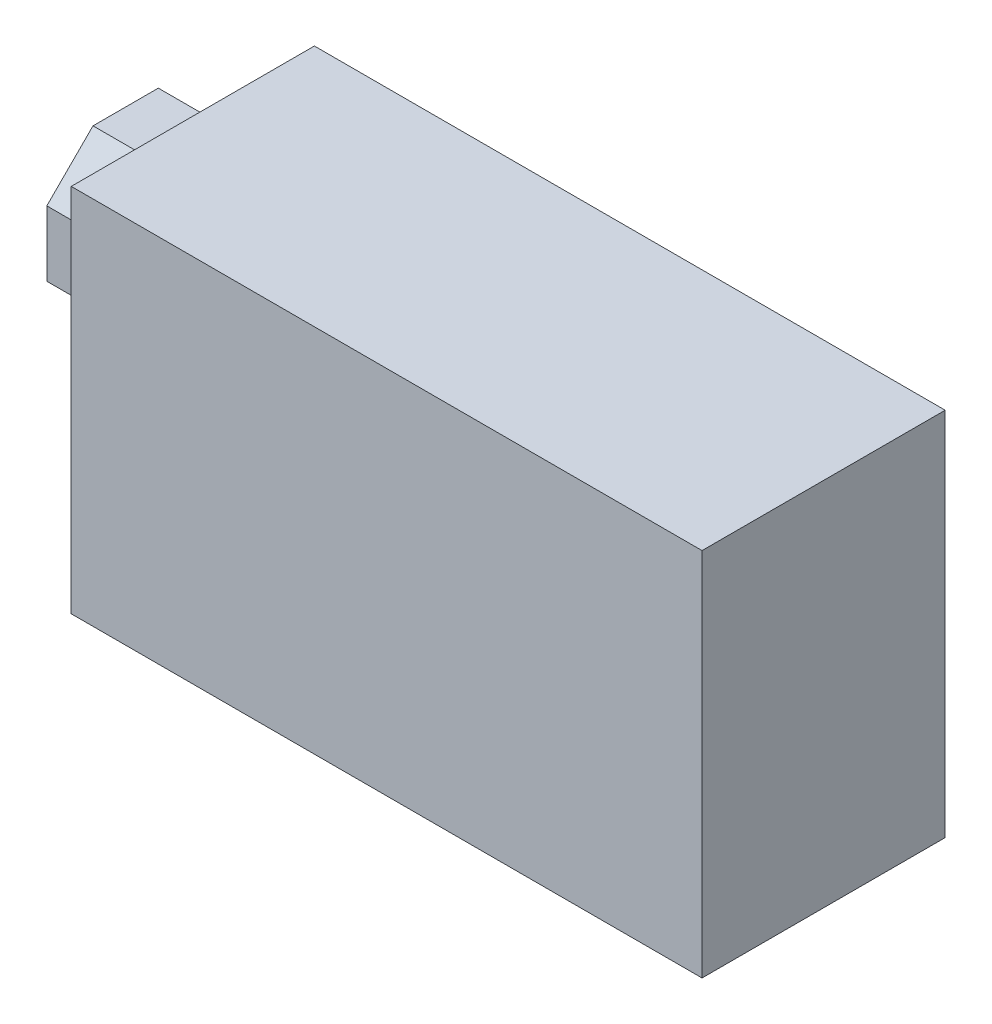
ISO-10303-21;
HEADER;
FILE_DESCRIPTION(('STEP AP214'),'2;1');
FILE_NAME('part.step','',(''),(''),'','','');
FILE_SCHEMA(('AUTOMOTIVE_DESIGN { 1 0 10303 214 1 1 1 1 }'));
ENDSEC;
DATA;
#1=APPLICATION_CONTEXT('core data for automotive mechanical design processes');
#2=APPLICATION_PROTOCOL_DEFINITION('international standard','automotive_design',2000,#1);
#3=PRODUCT_CONTEXT('',#1,'mechanical');
#4=PRODUCT('Part','Part','',(#3));
#5=PRODUCT_RELATED_PRODUCT_CATEGORY('part','',(#4));
#6=PRODUCT_DEFINITION_FORMATION('','',#4);
#7=PRODUCT_DEFINITION_CONTEXT('part definition',#1,'design');
#8=PRODUCT_DEFINITION('design','',#6,#7);
#9=PRODUCT_DEFINITION_SHAPE('','',#8);
#10=(LENGTH_UNIT() NAMED_UNIT(*) SI_UNIT(.MILLI.,.METRE.));
#11=(NAMED_UNIT(*) PLANE_ANGLE_UNIT() SI_UNIT($,.RADIAN.));
#12=(NAMED_UNIT(*) SI_UNIT($,.STERADIAN.) SOLID_ANGLE_UNIT());
#13=UNCERTAINTY_MEASURE_WITH_UNIT(LENGTH_MEASURE(1.E-05),#10,'distance_accuracy_value','');
#14=(GEOMETRIC_REPRESENTATION_CONTEXT(3) GLOBAL_UNCERTAINTY_ASSIGNED_CONTEXT((#13)) GLOBAL_UNIT_ASSIGNED_CONTEXT((#10,
#11,#12)) REPRESENTATION_CONTEXT('',''));
#15=CARTESIAN_POINT('',(0.,0.,0.));
#16=DIRECTION('',(0.,0.,1.));
#17=DIRECTION('',(1.,0.,0.));
#18=AXIS2_PLACEMENT_3D('',#15,#16,#17);
#19=CARTESIAN_POINT('',(0.,0.,17.018));
#20=DIRECTION('',(1.,0.,0.));
#21=DIRECTION('',(0.,0.,-1.));
#22=AXIS2_PLACEMENT_3D('',#19,#20,#21);
#23=PLANE('',#22);
#24=DIRECTION('',(0.,-1.,0.));
#25=VECTOR('',#24,1.);
#26=CARTESIAN_POINT('',(0.,0.,0.));
#27=LINE('',#26,#25);
#28=CARTESIAN_POINT('',(0.,25.908,0.));
#29=VERTEX_POINT('',#28);
#30=CARTESIAN_POINT('',(0.,0.,0.));
#31=VERTEX_POINT('',#30);
#32=EDGE_CURVE('E312',#29,#31,#27,.T.);
#33=ORIENTED_EDGE('',*,*,#32,.T.);
#34=DIRECTION('',(0.,0.,-1.));
#35=VECTOR('',#34,1.);
#36=CARTESIAN_POINT('',(0.,0.,17.018));
#37=LINE('',#36,#35);
#38=CARTESIAN_POINT('',(0.,0.,17.018));
#39=VERTEX_POINT('',#38);
#40=EDGE_CURVE('E44',#39,#31,#37,.T.);
#41=ORIENTED_EDGE('',*,*,#40,.F.);
#42=DIRECTION('',(0.,-1.,0.));
#43=VECTOR('',#42,1.);
#44=CARTESIAN_POINT('',(0.,0.,17.018));
#45=LINE('',#44,#43);
#46=CARTESIAN_POINT('',(0.,25.908,17.018));
#47=VERTEX_POINT('',#46);
#48=EDGE_CURVE('E313',#47,#39,#45,.T.);
#49=ORIENTED_EDGE('',*,*,#48,.F.);
#50=DIRECTION('',(0.,0.,-1.));
#51=VECTOR('',#50,1.);
#52=CARTESIAN_POINT('',(0.,25.908,17.018));
#53=LINE('',#52,#51);
#54=EDGE_CURVE('E323',#47,#29,#53,.T.);
#55=ORIENTED_EDGE('',*,*,#54,.T.);
#56=EDGE_LOOP('',(#33,#41,#49,#55));
#57=FACE_BOUND('',#56,.T.);
#58=CARTESIAN_POINT('',(0.,6.60269083227733,8.509));
#59=DIRECTION('',(1.,0.,0.));
#60=DIRECTION('',(0.,0.,-1.));
#61=AXIS2_PLACEMENT_3D('',#58,#59,#60);
#62=CIRCLE('',#61,3.556);
#63=CARTESIAN_POINT('',(0.,6.60269083227733,4.953));
#64=VERTEX_POINT('',#63);
#65=EDGE_CURVE('E11',#64,#64,#62,.F.);
#66=ORIENTED_EDGE('',*,*,#65,.F.);
#67=EDGE_LOOP('',(#66));
#68=FACE_BOUND('',#67,.T.);
#69=DIRECTION('',(0.,1.,0.));
#70=VECTOR('',#69,1.);
#71=CARTESIAN_POINT('',(0.,16.311427677462,14.0278922035849));
#72=LINE('',#71,#70);
#73=CARTESIAN_POINT('',(0.,16.311427677462,14.0278922035849));
#74=VERTEX_POINT('',#73);
#75=CARTESIAN_POINT('',(0.,20.883427677462,14.0278922035849));
#76=VERTEX_POINT('',#75);
#77=EDGE_CURVE('E265',#74,#76,#72,.T.);
#78=ORIENTED_EDGE('',*,*,#77,.F.);
#79=DIRECTION('',(0.,0.707106781186548,0.707106781186547));
#80=VECTOR('',#79,1.);
#81=CARTESIAN_POINT('',(0.,13.0785354738771,10.795));
#82=LINE('',#81,#80);
#83=CARTESIAN_POINT('',(0.,13.0785354738771,10.795));
#84=VERTEX_POINT('',#83);
#85=EDGE_CURVE('E250',#84,#74,#82,.T.);
#86=ORIENTED_EDGE('',*,*,#85,.F.);
#87=DIRECTION('',(0.,0.,1.));
#88=VECTOR('',#87,1.);
#89=CARTESIAN_POINT('',(0.,13.0785354738771,6.223));
#90=LINE('',#89,#88);
#91=CARTESIAN_POINT('',(0.,13.0785354738771,6.223));
#92=VERTEX_POINT('',#91);
#93=EDGE_CURVE('E282',#92,#84,#90,.T.);
#94=ORIENTED_EDGE('',*,*,#93,.F.);
#95=DIRECTION('',(0.,-0.707106781186547,0.707106781186547));
#96=VECTOR('',#95,1.);
#97=CARTESIAN_POINT('',(0.,16.311427677462,2.99010779641511));
#98=LINE('',#97,#96);
#99=CARTESIAN_POINT('',(0.,16.311427677462,2.99010779641511));
#100=VERTEX_POINT('',#99);
#101=EDGE_CURVE('E279',#100,#92,#98,.T.);
#102=ORIENTED_EDGE('',*,*,#101,.F.);
#103=DIRECTION('',(0.,-1.,0.));
#104=VECTOR('',#103,1.);
#105=CARTESIAN_POINT('',(0.,20.883427677462,2.99010779641511));
#106=LINE('',#105,#104);
#107=CARTESIAN_POINT('',(0.,20.883427677462,2.99010779641511));
#108=VERTEX_POINT('',#107);
#109=EDGE_CURVE('E276',#108,#100,#106,.T.);
#110=ORIENTED_EDGE('',*,*,#109,.F.);
#111=DIRECTION('',(0.,-0.707106781186548,-0.707106781186547));
#112=VECTOR('',#111,1.);
#113=CARTESIAN_POINT('',(0.,24.1163198810469,6.223));
#114=LINE('',#113,#112);
#115=CARTESIAN_POINT('',(0.,24.1163198810469,6.223));
#116=VERTEX_POINT('',#115);
#117=EDGE_CURVE('E273',#116,#108,#114,.T.);
#118=ORIENTED_EDGE('',*,*,#117,.F.);
#119=DIRECTION('',(0.,0.,-1.));
#120=VECTOR('',#119,1.);
#121=CARTESIAN_POINT('',(0.,24.1163198810469,10.795));
#122=LINE('',#121,#120);
#123=CARTESIAN_POINT('',(0.,24.1163198810469,10.795));
#124=VERTEX_POINT('',#123);
#125=EDGE_CURVE('E270',#124,#116,#122,.T.);
#126=ORIENTED_EDGE('',*,*,#125,.F.);
#127=DIRECTION('',(0.,0.707106781186548,-0.707106781186548));
#128=VECTOR('',#127,1.);
#129=CARTESIAN_POINT('',(0.,20.883427677462,14.0278922035849));
#130=LINE('',#129,#128);
#131=EDGE_CURVE('E59',#76,#124,#130,.T.);
#132=ORIENTED_EDGE('',*,*,#131,.F.);
#133=EDGE_LOOP('',(#78,#86,#94,#102,#110,#118,#126,#132));
#134=FACE_BOUND('',#133,.T.);
#135=ADVANCED_FACE('F37',(#57,#68,#134),#23,.F.);
#136=CARTESIAN_POINT('',(0.,0.,17.018));
#137=DIRECTION('',(0.,1.,0.));
#138=DIRECTION('',(0.,0.,1.));
#139=AXIS2_PLACEMENT_3D('',#136,#137,#138);
#140=PLANE('',#139);
#141=DIRECTION('',(1.,0.,0.));
#142=VECTOR('',#141,1.);
#143=CARTESIAN_POINT('',(0.,0.,0.));
#144=LINE('',#143,#142);
#145=CARTESIAN_POINT('',(44.15,0.,0.));
#146=VERTEX_POINT('',#145);
#147=EDGE_CURVE('E326',#31,#146,#144,.T.);
#148=ORIENTED_EDGE('',*,*,#147,.T.);
#149=DIRECTION('',(0.,0.,-1.));
#150=VECTOR('',#149,1.);
#151=CARTESIAN_POINT('',(44.15,0.,17.018));
#152=LINE('',#151,#150);
#153=CARTESIAN_POINT('',(44.15,0.,17.018));
#154=VERTEX_POINT('',#153);
#155=EDGE_CURVE('E336',#154,#146,#152,.T.);
#156=ORIENTED_EDGE('',*,*,#155,.F.);
#157=DIRECTION('',(1.,0.,0.));
#158=VECTOR('',#157,1.);
#159=CARTESIAN_POINT('',(0.,0.,17.018));
#160=LINE('',#159,#158);
#161=EDGE_CURVE('E316',#39,#154,#160,.T.);
#162=ORIENTED_EDGE('',*,*,#161,.F.);
#163=ORIENTED_EDGE('',*,*,#40,.T.);
#164=EDGE_LOOP('',(#148,#156,#162,#163));
#165=FACE_BOUND('',#164,.T.);
#166=ADVANCED_FACE('F341',(#165),#140,.F.);
#167=CARTESIAN_POINT('',(44.15,0.,17.018));
#168=DIRECTION('',(-1.,0.,0.));
#169=DIRECTION('',(0.,0.,1.));
#170=AXIS2_PLACEMENT_3D('',#167,#168,#169);
#171=PLANE('',#170);
#172=DIRECTION('',(0.,1.,0.));
#173=VECTOR('',#172,1.);
#174=CARTESIAN_POINT('',(44.15,0.,0.));
#175=LINE('',#174,#173);
#176=CARTESIAN_POINT('',(44.15,25.908,0.));
#177=VERTEX_POINT('',#176);
#178=EDGE_CURVE('E328',#146,#177,#175,.T.);
#179=ORIENTED_EDGE('',*,*,#178,.T.);
#180=DIRECTION('',(0.,0.,-1.));
#181=VECTOR('',#180,1.);
#182=CARTESIAN_POINT('',(44.15,25.908,17.018));
#183=LINE('',#182,#181);
#184=CARTESIAN_POINT('',(44.15,25.908,17.018));
#185=VERTEX_POINT('',#184);
#186=EDGE_CURVE('E333',#185,#177,#183,.T.);
#187=ORIENTED_EDGE('',*,*,#186,.F.);
#188=DIRECTION('',(0.,1.,0.));
#189=VECTOR('',#188,1.);
#190=CARTESIAN_POINT('',(44.15,0.,17.018));
#191=LINE('',#190,#189);
#192=EDGE_CURVE('E319',#154,#185,#191,.T.);
#193=ORIENTED_EDGE('',*,*,#192,.F.);
#194=ORIENTED_EDGE('',*,*,#155,.T.);
#195=EDGE_LOOP('',(#179,#187,#193,#194));
#196=FACE_BOUND('',#195,.T.);
#197=ADVANCED_FACE('F354',(#196),#171,.F.);
#198=CARTESIAN_POINT('',(0.,25.908,17.018));
#199=DIRECTION('',(0.,-1.,0.));
#200=DIRECTION('',(1.,0.,0.));
#201=AXIS2_PLACEMENT_3D('',#198,#199,#200);
#202=PLANE('',#201);
#203=DIRECTION('',(-1.,0.,0.));
#204=VECTOR('',#203,1.);
#205=CARTESIAN_POINT('',(0.,25.908,0.));
#206=LINE('',#205,#204);
#207=EDGE_CURVE('E317',#177,#29,#206,.T.);
#208=ORIENTED_EDGE('',*,*,#207,.T.);
#209=ORIENTED_EDGE('',*,*,#54,.F.);
#210=DIRECTION('',(-1.,0.,0.));
#211=VECTOR('',#210,1.);
#212=CARTESIAN_POINT('',(0.,25.908,17.018));
#213=LINE('',#212,#211);
#214=EDGE_CURVE('E321',#185,#47,#213,.T.);
#215=ORIENTED_EDGE('',*,*,#214,.F.);
#216=ORIENTED_EDGE('',*,*,#186,.T.);
#217=EDGE_LOOP('',(#208,#209,#215,#216));
#218=FACE_BOUND('',#217,.T.);
#219=ADVANCED_FACE('F358',(#218),#202,.F.);
#220=CARTESIAN_POINT('',(0.,0.,17.018));
#221=DIRECTION('',(0.,0.,-1.));
#222=DIRECTION('',(-1.,0.,0.));
#223=AXIS2_PLACEMENT_3D('',#220,#221,#222);
#224=PLANE('',#223);
#225=ORIENTED_EDGE('',*,*,#48,.T.);
#226=ORIENTED_EDGE('',*,*,#161,.T.);
#227=ORIENTED_EDGE('',*,*,#192,.T.);
#228=ORIENTED_EDGE('',*,*,#214,.T.);
#229=EDGE_LOOP('',(#225,#226,#227,#228));
#230=FACE_BOUND('',#229,.T.);
#231=ADVANCED_FACE('F360',(#230),#224,.F.);
#232=CARTESIAN_POINT('',(0.,0.,0.));
#233=DIRECTION('',(0.,0.,-1.));
#234=DIRECTION('',(-1.,0.,0.));
#235=AXIS2_PLACEMENT_3D('',#232,#233,#234);
#236=PLANE('',#235);
#237=ORIENTED_EDGE('',*,*,#32,.F.);
#238=ORIENTED_EDGE('',*,*,#207,.F.);
#239=ORIENTED_EDGE('',*,*,#178,.F.);
#240=ORIENTED_EDGE('',*,*,#147,.F.);
#241=EDGE_LOOP('',(#237,#238,#239,#240));
#242=FACE_BOUND('',#241,.T.);
#243=ADVANCED_FACE('F350',(#242),#236,.T.);
#244=CARTESIAN_POINT('',(-4.7,6.60269083227733,8.509));
#245=DIRECTION('',(1.,0.,0.));
#246=DIRECTION('',(0.,0.,-1.));
#247=AXIS2_PLACEMENT_3D('',#244,#245,#246);
#248=CYLINDRICAL_SURFACE('',#247,3.556);
#249=CARTESIAN_POINT('',(-4.7,6.60269083227733,8.509));
#250=DIRECTION('',(-1.,0.,0.));
#251=DIRECTION('',(0.,0.,1.));
#252=AXIS2_PLACEMENT_3D('',#249,#250,#251);
#253=CIRCLE('',#252,3.556);
#254=CARTESIAN_POINT('',(-4.7,6.60269083227733,12.065));
#255=VERTEX_POINT('',#254);
#256=EDGE_CURVE('E309',#255,#255,#253,.T.);
#257=ORIENTED_EDGE('',*,*,#256,.F.);
#258=EDGE_LOOP('',(#257));
#259=FACE_BOUND('',#258,.T.);
#260=ORIENTED_EDGE('',*,*,#65,.T.);
#261=EDGE_LOOP('',(#260));
#262=FACE_BOUND('',#261,.T.);
#263=ADVANCED_FACE('F367',(#259,#262),#248,.T.);
#264=CARTESIAN_POINT('',(-4.7,6.60269083227733,8.509));
#265=DIRECTION('',(-1.,0.,0.));
#266=DIRECTION('',(0.,0.,1.));
#267=AXIS2_PLACEMENT_3D('',#264,#265,#266);
#268=PLANE('',#267);
#269=CARTESIAN_POINT('',(-4.7,6.60269083227733,8.509));
#270=DIRECTION('',(-1.,0.,0.));
#271=DIRECTION('',(0.,0.,1.));
#272=AXIS2_PLACEMENT_3D('',#269,#270,#271);
#273=CIRCLE('',#272,2.43860682896145);
#274=CARTESIAN_POINT('',(-4.7,6.60269083227733,10.9476068289615));
#275=VERTEX_POINT('',#274);
#276=EDGE_CURVE('E200',#275,#275,#273,.T.);
#277=ORIENTED_EDGE('',*,*,#276,.F.);
#278=EDGE_LOOP('',(#277));
#279=FACE_BOUND('',#278,.T.);
#280=ORIENTED_EDGE('',*,*,#256,.T.);
#281=EDGE_LOOP('',(#280));
#282=FACE_BOUND('',#281,.T.);
#283=ADVANCED_FACE('F400',(#279,#282),#268,.T.);
#284=CARTESIAN_POINT('',(-4.7,16.311427677462,14.0278922035849));
#285=DIRECTION('',(0.,0.,-1.));
#286=DIRECTION('',(0.,1.,0.));
#287=AXIS2_PLACEMENT_3D('',#284,#285,#286);
#288=PLANE('',#287);
#289=ORIENTED_EDGE('',*,*,#77,.T.);
#290=DIRECTION('',(1.,0.,0.));
#291=VECTOR('',#290,1.);
#292=CARTESIAN_POINT('',(-4.7,20.883427677462,14.0278922035849));
#293=LINE('',#292,#291);
#294=CARTESIAN_POINT('',(-4.7,20.883427677462,14.0278922035849));
#295=VERTEX_POINT('',#294);
#296=EDGE_CURVE('E307',#295,#76,#293,.T.);
#297=ORIENTED_EDGE('',*,*,#296,.F.);
#298=DIRECTION('',(0.,1.,0.));
#299=VECTOR('',#298,1.);
#300=CARTESIAN_POINT('',(-4.7,16.311427677462,14.0278922035849));
#301=LINE('',#300,#299);
#302=CARTESIAN_POINT('',(-4.7,16.311427677462,14.0278922035849));
#303=VERTEX_POINT('',#302);
#304=EDGE_CURVE('E246',#303,#295,#301,.T.);
#305=ORIENTED_EDGE('',*,*,#304,.F.);
#306=DIRECTION('',(1.,0.,0.));
#307=VECTOR('',#306,1.);
#308=CARTESIAN_POINT('',(-4.7,16.311427677462,14.0278922035849));
#309=LINE('',#308,#307);
#310=EDGE_CURVE('E264',#303,#74,#309,.T.);
#311=ORIENTED_EDGE('',*,*,#310,.T.);
#312=EDGE_LOOP('',(#289,#297,#305,#311));
#313=FACE_BOUND('',#312,.T.);
#314=ADVANCED_FACE('F423',(#313),#288,.F.);
#315=CARTESIAN_POINT('',(-4.7,20.883427677462,14.0278922035849));
#316=DIRECTION('',(0.,-0.707106781186548,-0.707106781186548));
#317=DIRECTION('',(0.,0.707106781186548,-0.707106781186548));
#318=AXIS2_PLACEMENT_3D('',#315,#316,#317);
#319=PLANE('',#318);
#320=ORIENTED_EDGE('',*,*,#131,.T.);
#321=DIRECTION('',(1.,0.,0.));
#322=VECTOR('',#321,1.);
#323=CARTESIAN_POINT('',(-4.7,24.1163198810469,10.795));
#324=LINE('',#323,#322);
#325=CARTESIAN_POINT('',(-4.7,24.1163198810469,10.795));
#326=VERTEX_POINT('',#325);
#327=EDGE_CURVE('E304',#326,#124,#324,.T.);
#328=ORIENTED_EDGE('',*,*,#327,.F.);
#329=DIRECTION('',(0.,0.707106781186548,-0.707106781186548));
#330=VECTOR('',#329,1.);
#331=CARTESIAN_POINT('',(-4.7,20.883427677462,14.0278922035849));
#332=LINE('',#331,#330);
#333=EDGE_CURVE('E249',#295,#326,#332,.T.);
#334=ORIENTED_EDGE('',*,*,#333,.F.);
#335=ORIENTED_EDGE('',*,*,#296,.T.);
#336=EDGE_LOOP('',(#320,#328,#334,#335));
#337=FACE_BOUND('',#336,.T.);
#338=ADVANCED_FACE('F427',(#337),#319,.F.);
#339=CARTESIAN_POINT('',(-4.7,24.1163198810469,10.795));
#340=DIRECTION('',(0.,-1.,0.));
#341=DIRECTION('',(0.,0.,-1.));
#342=AXIS2_PLACEMENT_3D('',#339,#340,#341);
#343=PLANE('',#342);
#344=ORIENTED_EDGE('',*,*,#125,.T.);
#345=DIRECTION('',(1.,0.,0.));
#346=VECTOR('',#345,1.);
#347=CARTESIAN_POINT('',(-4.7,24.1163198810469,6.223));
#348=LINE('',#347,#346);
#349=CARTESIAN_POINT('',(-4.7,24.1163198810469,6.223));
#350=VERTEX_POINT('',#349);
#351=EDGE_CURVE('E301',#350,#116,#348,.T.);
#352=ORIENTED_EDGE('',*,*,#351,.F.);
#353=DIRECTION('',(0.,0.,-1.));
#354=VECTOR('',#353,1.);
#355=CARTESIAN_POINT('',(-4.7,24.1163198810469,10.795));
#356=LINE('',#355,#354);
#357=EDGE_CURVE('E252',#326,#350,#356,.T.);
#358=ORIENTED_EDGE('',*,*,#357,.F.);
#359=ORIENTED_EDGE('',*,*,#327,.T.);
#360=EDGE_LOOP('',(#344,#352,#358,#359));
#361=FACE_BOUND('',#360,.T.);
#362=ADVANCED_FACE('F437',(#361),#343,.F.);
#363=CARTESIAN_POINT('',(-4.7,24.1163198810469,6.223));
#364=DIRECTION('',(0.,-0.707106781186547,0.707106781186548));
#365=DIRECTION('',(0.,-0.707106781186548,-0.707106781186547));
#366=AXIS2_PLACEMENT_3D('',#363,#364,#365);
#367=PLANE('',#366);
#368=ORIENTED_EDGE('',*,*,#117,.T.);
#369=DIRECTION('',(1.,0.,0.));
#370=VECTOR('',#369,1.);
#371=CARTESIAN_POINT('',(-4.7,20.883427677462,2.99010779641511));
#372=LINE('',#371,#370);
#373=CARTESIAN_POINT('',(-4.7,20.883427677462,2.99010779641511));
#374=VERTEX_POINT('',#373);
#375=EDGE_CURVE('E298',#374,#108,#372,.T.);
#376=ORIENTED_EDGE('',*,*,#375,.F.);
#377=DIRECTION('',(0.,-0.707106781186548,-0.707106781186547));
#378=VECTOR('',#377,1.);
#379=CARTESIAN_POINT('',(-4.7,24.1163198810469,6.223));
#380=LINE('',#379,#378);
#381=EDGE_CURVE('E254',#350,#374,#380,.T.);
#382=ORIENTED_EDGE('',*,*,#381,.F.);
#383=ORIENTED_EDGE('',*,*,#351,.T.);
#384=EDGE_LOOP('',(#368,#376,#382,#383));
#385=FACE_BOUND('',#384,.T.);
#386=ADVANCED_FACE('F457',(#385),#367,.F.);
#387=CARTESIAN_POINT('',(-4.7,20.883427677462,2.99010779641511));
#388=DIRECTION('',(0.,0.,1.));
#389=DIRECTION('',(1.,0.,0.));
#390=AXIS2_PLACEMENT_3D('',#387,#388,#389);
#391=PLANE('',#390);
#392=ORIENTED_EDGE('',*,*,#109,.T.);
#393=DIRECTION('',(1.,0.,0.));
#394=VECTOR('',#393,1.);
#395=CARTESIAN_POINT('',(-4.7,16.311427677462,2.99010779641511));
#396=LINE('',#395,#394);
#397=CARTESIAN_POINT('',(-4.7,16.311427677462,2.99010779641511));
#398=VERTEX_POINT('',#397);
#399=EDGE_CURVE('E295',#398,#100,#396,.T.);
#400=ORIENTED_EDGE('',*,*,#399,.F.);
#401=DIRECTION('',(0.,-1.,0.));
#402=VECTOR('',#401,1.);
#403=CARTESIAN_POINT('',(-4.7,20.883427677462,2.99010779641511));
#404=LINE('',#403,#402);
#405=EDGE_CURVE('E256',#374,#398,#404,.T.);
#406=ORIENTED_EDGE('',*,*,#405,.F.);
#407=ORIENTED_EDGE('',*,*,#375,.T.);
#408=EDGE_LOOP('',(#392,#400,#406,#407));
#409=FACE_BOUND('',#408,.T.);
#410=ADVANCED_FACE('F467',(#409),#391,.F.);
#411=CARTESIAN_POINT('',(-4.7,16.311427677462,2.99010779641511));
#412=DIRECTION('',(0.,0.707106781186548,0.707106781186548));
#413=DIRECTION('',(0.,-0.707106781186548,0.707106781186548));
#414=AXIS2_PLACEMENT_3D('',#411,#412,#413);
#415=PLANE('',#414);
#416=ORIENTED_EDGE('',*,*,#101,.T.);
#417=DIRECTION('',(1.,0.,0.));
#418=VECTOR('',#417,1.);
#419=CARTESIAN_POINT('',(-4.7,13.0785354738771,6.223));
#420=LINE('',#419,#418);
#421=CARTESIAN_POINT('',(-4.7,13.0785354738771,6.223));
#422=VERTEX_POINT('',#421);
#423=EDGE_CURVE('E292',#422,#92,#420,.T.);
#424=ORIENTED_EDGE('',*,*,#423,.F.);
#425=DIRECTION('',(0.,-0.707106781186547,0.707106781186547));
#426=VECTOR('',#425,1.);
#427=CARTESIAN_POINT('',(-4.7,16.311427677462,2.99010779641511));
#428=LINE('',#427,#426);
#429=EDGE_CURVE('E258',#398,#422,#428,.T.);
#430=ORIENTED_EDGE('',*,*,#429,.F.);
#431=ORIENTED_EDGE('',*,*,#399,.T.);
#432=EDGE_LOOP('',(#416,#424,#430,#431));
#433=FACE_BOUND('',#432,.T.);
#434=ADVANCED_FACE('F447',(#433),#415,.F.);
#435=CARTESIAN_POINT('',(-4.7,13.0785354738771,6.223));
#436=DIRECTION('',(0.,1.,0.));
#437=DIRECTION('',(0.,0.,1.));
#438=AXIS2_PLACEMENT_3D('',#435,#436,#437);
#439=PLANE('',#438);
#440=ORIENTED_EDGE('',*,*,#93,.T.);
#441=DIRECTION('',(1.,0.,0.));
#442=VECTOR('',#441,1.);
#443=CARTESIAN_POINT('',(-4.7,13.0785354738771,10.795));
#444=LINE('',#443,#442);
#445=CARTESIAN_POINT('',(-4.7,13.0785354738771,10.795));
#446=VERTEX_POINT('',#445);
#447=EDGE_CURVE('E289',#446,#84,#444,.T.);
#448=ORIENTED_EDGE('',*,*,#447,.F.);
#449=DIRECTION('',(0.,0.,1.));
#450=VECTOR('',#449,1.);
#451=CARTESIAN_POINT('',(-4.7,13.0785354738771,6.223));
#452=LINE('',#451,#450);
#453=EDGE_CURVE('E260',#422,#446,#452,.T.);
#454=ORIENTED_EDGE('',*,*,#453,.F.);
#455=ORIENTED_EDGE('',*,*,#423,.T.);
#456=EDGE_LOOP('',(#440,#448,#454,#455));
#457=FACE_BOUND('',#456,.T.);
#458=ADVANCED_FACE('F413',(#457),#439,.F.);
#459=CARTESIAN_POINT('',(-4.7,13.0785354738771,10.795));
#460=DIRECTION('',(0.,0.707106781186547,-0.707106781186548));
#461=DIRECTION('',(0.,0.707106781186548,0.707106781186547));
#462=AXIS2_PLACEMENT_3D('',#459,#460,#461);
#463=PLANE('',#462);
#464=ORIENTED_EDGE('',*,*,#85,.T.);
#465=ORIENTED_EDGE('',*,*,#310,.F.);
#466=DIRECTION('',(0.,0.707106781186548,0.707106781186547));
#467=VECTOR('',#466,1.);
#468=CARTESIAN_POINT('',(-4.7,13.0785354738771,10.795));
#469=LINE('',#468,#467);
#470=EDGE_CURVE('E262',#446,#303,#469,.T.);
#471=ORIENTED_EDGE('',*,*,#470,.F.);
#472=ORIENTED_EDGE('',*,*,#447,.T.);
#473=EDGE_LOOP('',(#464,#465,#471,#472));
#474=FACE_BOUND('',#473,.T.);
#475=ADVANCED_FACE('F407',(#474),#463,.F.);
#476=CARTESIAN_POINT('',(-4.7,0.,0.));
#477=DIRECTION('',(-1.,0.,0.));
#478=DIRECTION('',(0.,0.,1.));
#479=AXIS2_PLACEMENT_3D('',#476,#477,#478);
#480=PLANE('',#479);
#481=DIRECTION('',(0.,0.999836180370934,-0.0181000668855701));
#482=VECTOR('',#481,1.);
#483=CARTESIAN_POINT('',(-4.7,16.987608757402,12.6302022939872));
#484=LINE('',#483,#482);
#485=CARTESIAN_POINT('',(-4.7,16.987608757402,12.6302022939872));
#486=VERTEX_POINT('',#485);
#487=CARTESIAN_POINT('',(-4.7,20.3763142430646,12.5688564483875));
#488=VERTEX_POINT('',#487);
#489=EDGE_CURVE('E51',#486,#488,#484,.T.);
#490=ORIENTED_EDGE('',*,*,#489,.F.);
#491=DIRECTION('',(0.,0.71978962325066,0.694192263181227));
#492=VECTOR('',#491,1.);
#493=CARTESIAN_POINT('',(-4.7,14.5480540656248,10.2774037290523));
#494=LINE('',#493,#492);
#495=CARTESIAN_POINT('',(-4.7,14.5480540656248,10.2774037290523));
#496=VERTEX_POINT('',#495);
#497=EDGE_CURVE('E194',#496,#486,#494,.T.);
#498=ORIENTED_EDGE('',*,*,#497,.F.);
#499=DIRECTION('',(0.,0.0181000668855701,0.999836180370933));
#500=VECTOR('',#499,1.);
#501=CARTESIAN_POINT('',(-4.7,14.4867082200251,6.88869824338967));
#502=LINE('',#501,#500);
#503=CARTESIAN_POINT('',(-4.7,14.4867082200251,6.88869824338967));
#504=VERTEX_POINT('',#503);
#505=EDGE_CURVE('E197',#504,#496,#502,.T.);
#506=ORIENTED_EDGE('',*,*,#505,.F.);
#507=DIRECTION('',(0.,-0.694192263181226,0.719789623250661));
#508=VECTOR('',#507,1.);
#509=CARTESIAN_POINT('',(-4.7,16.83950678496,4.44914355161245));
#510=LINE('',#509,#508);
#511=CARTESIAN_POINT('',(-4.7,16.83950678496,4.44914355161245));
#512=VERTEX_POINT('',#511);
#513=EDGE_CURVE('E228',#512,#504,#510,.T.);
#514=ORIENTED_EDGE('',*,*,#513,.F.);
#515=DIRECTION('',(0.,-0.999836180370934,0.0181000668855701));
#516=VECTOR('',#515,1.);
#517=CARTESIAN_POINT('',(-4.7,20.2282122706226,4.38779770601279));
#518=LINE('',#517,#516);
#519=CARTESIAN_POINT('',(-4.7,20.2282122706226,4.38779770601279));
#520=VERTEX_POINT('',#519);
#521=EDGE_CURVE('E225',#520,#512,#518,.T.);
#522=ORIENTED_EDGE('',*,*,#521,.F.);
#523=DIRECTION('',(0.,-0.71978962325066,-0.694192263181226));
#524=VECTOR('',#523,1.);
#525=CARTESIAN_POINT('',(-4.7,22.6677669623999,6.74059627094772));
#526=LINE('',#525,#524);
#527=CARTESIAN_POINT('',(-4.7,22.6677669623999,6.74059627094772));
#528=VERTEX_POINT('',#527);
#529=EDGE_CURVE('E222',#528,#520,#526,.T.);
#530=ORIENTED_EDGE('',*,*,#529,.F.);
#531=DIRECTION('',(0.,-0.0181000668855696,-0.999836180370934));
#532=VECTOR('',#531,1.);
#533=CARTESIAN_POINT('',(-4.7,22.7291128079995,10.1293017566103));
#534=LINE('',#533,#532);
#535=CARTESIAN_POINT('',(-4.7,22.7291128079995,10.1293017566103));
#536=VERTEX_POINT('',#535);
#537=EDGE_CURVE('E219',#536,#528,#534,.T.);
#538=ORIENTED_EDGE('',*,*,#537,.F.);
#539=DIRECTION('',(0.,0.694192263181227,-0.71978962325066));
#540=VECTOR('',#539,1.);
#541=CARTESIAN_POINT('',(-4.7,20.3763142430646,12.5688564483875));
#542=LINE('',#541,#540);
#543=EDGE_CURVE('E217',#488,#536,#542,.T.);
#544=ORIENTED_EDGE('',*,*,#543,.F.);
#545=EDGE_LOOP('',(#490,#498,#506,#514,#522,#530,#538,#544));
#546=FACE_BOUND('',#545,.T.);
#547=ORIENTED_EDGE('',*,*,#304,.T.);
#548=ORIENTED_EDGE('',*,*,#333,.T.);
#549=ORIENTED_EDGE('',*,*,#357,.T.);
#550=ORIENTED_EDGE('',*,*,#381,.T.);
#551=ORIENTED_EDGE('',*,*,#405,.T.);
#552=ORIENTED_EDGE('',*,*,#429,.T.);
#553=ORIENTED_EDGE('',*,*,#453,.T.);
#554=ORIENTED_EDGE('',*,*,#470,.T.);
#555=EDGE_LOOP('',(#547,#548,#549,#550,#551,#552,#553,#554));
#556=FACE_BOUND('',#555,.T.);
#557=ADVANCED_FACE('F412',(#546,#556),#480,.T.);
#558=CARTESIAN_POINT('',(-0.890000000000001,16.987608757402,12.6302022939872));
#559=DIRECTION('',(0.,0.0181000668855701,0.999836180370933));
#560=DIRECTION('',(0.,-0.999836180370934,0.0181000668855701));
#561=AXIS2_PLACEMENT_3D('',#558,#559,#560);
#562=PLANE('',#561);
#563=ORIENTED_EDGE('',*,*,#489,.T.);
#564=DIRECTION('',(-1.,0.,0.));
#565=VECTOR('',#564,1.);
#566=CARTESIAN_POINT('',(-0.890000000000001,20.3763142430646,12.5688564483875));
#567=LINE('',#566,#565);
#568=CARTESIAN_POINT('',(-0.890000000000001,20.3763142430646,12.5688564483875));
#569=VERTEX_POINT('',#568);
#570=EDGE_CURVE('E171',#569,#488,#567,.T.);
#571=ORIENTED_EDGE('',*,*,#570,.F.);
#572=DIRECTION('',(0.,0.999836180370934,-0.0181000668855701));
#573=VECTOR('',#572,1.);
#574=CARTESIAN_POINT('',(-0.890000000000001,16.987608757402,12.6302022939872));
#575=LINE('',#574,#573);
#576=CARTESIAN_POINT('',(-0.890000000000001,16.987608757402,12.6302022939872));
#577=VERTEX_POINT('',#576);
#578=EDGE_CURVE('E175',#577,#569,#575,.T.);
#579=ORIENTED_EDGE('',*,*,#578,.F.);
#580=DIRECTION('',(-1.,0.,0.));
#581=VECTOR('',#580,1.);
#582=CARTESIAN_POINT('',(-0.890000000000001,16.987608757402,12.6302022939872));
#583=LINE('',#582,#581);
#584=EDGE_CURVE('E233',#577,#486,#583,.T.);
#585=ORIENTED_EDGE('',*,*,#584,.T.);
#586=EDGE_LOOP('',(#563,#571,#579,#585));
#587=FACE_BOUND('',#586,.T.);
#588=ADVANCED_FACE('F173',(#587),#562,.F.);
#589=CARTESIAN_POINT('',(-0.890000000000001,14.5480540656248,10.2774037290523));
#590=DIRECTION('',(0.,-0.694192263181227,0.71978962325066));
#591=DIRECTION('',(0.,-0.71978962325066,-0.694192263181227));
#592=AXIS2_PLACEMENT_3D('',#589,#590,#591);
#593=PLANE('',#592);
#594=ORIENTED_EDGE('',*,*,#497,.T.);
#595=ORIENTED_EDGE('',*,*,#584,.F.);
#596=DIRECTION('',(0.,0.71978962325066,0.694192263181227));
#597=VECTOR('',#596,1.);
#598=CARTESIAN_POINT('',(-0.890000000000001,14.5480540656248,10.2774037290523));
#599=LINE('',#598,#597);
#600=CARTESIAN_POINT('',(-0.890000000000001,14.5480540656248,10.2774037290523));
#601=VERTEX_POINT('',#600);
#602=EDGE_CURVE('E181',#601,#577,#599,.T.);
#603=ORIENTED_EDGE('',*,*,#602,.F.);
#604=DIRECTION('',(-1.,0.,0.));
#605=VECTOR('',#604,1.);
#606=CARTESIAN_POINT('',(-0.890000000000001,14.5480540656248,10.2774037290523));
#607=LINE('',#606,#605);
#608=EDGE_CURVE('E235',#601,#496,#607,.T.);
#609=ORIENTED_EDGE('',*,*,#608,.T.);
#610=EDGE_LOOP('',(#594,#595,#603,#609));
#611=FACE_BOUND('',#610,.T.);
#612=ADVANCED_FACE('F555',(#611),#593,.F.);
#613=CARTESIAN_POINT('',(-0.890000000000001,14.4867082200251,6.88869824338967));
#614=DIRECTION('',(0.,-0.999836180370934,0.0181000668855701));
#615=DIRECTION('',(0.,-0.0181000668855701,-0.999836180370934));
#616=AXIS2_PLACEMENT_3D('',#613,#614,#615);
#617=PLANE('',#616);
#618=ORIENTED_EDGE('',*,*,#505,.T.);
#619=ORIENTED_EDGE('',*,*,#608,.F.);
#620=DIRECTION('',(0.,0.0181000668855701,0.999836180370933));
#621=VECTOR('',#620,1.);
#622=CARTESIAN_POINT('',(-0.890000000000001,14.4867082200251,6.88869824338967));
#623=LINE('',#622,#621);
#624=CARTESIAN_POINT('',(-0.890000000000001,14.4867082200251,6.88869824338967));
#625=VERTEX_POINT('',#624);
#626=EDGE_CURVE('E213',#625,#601,#623,.T.);
#627=ORIENTED_EDGE('',*,*,#626,.F.);
#628=DIRECTION('',(-1.,0.,0.));
#629=VECTOR('',#628,1.);
#630=CARTESIAN_POINT('',(-0.890000000000001,14.4867082200251,6.88869824338967));
#631=LINE('',#630,#629);
#632=EDGE_CURVE('E237',#625,#504,#631,.T.);
#633=ORIENTED_EDGE('',*,*,#632,.T.);
#634=EDGE_LOOP('',(#618,#619,#627,#633));
#635=FACE_BOUND('',#634,.T.);
#636=ADVANCED_FACE('F532',(#635),#617,.F.);
#637=CARTESIAN_POINT('',(-0.890000000000001,16.83950678496,4.44914355161245));
#638=DIRECTION('',(0.,-0.719789623250661,-0.694192263181226));
#639=DIRECTION('',(0.,0.694192263181226,-0.719789623250661));
#640=AXIS2_PLACEMENT_3D('',#637,#638,#639);
#641=PLANE('',#640);
#642=ORIENTED_EDGE('',*,*,#513,.T.);
#643=ORIENTED_EDGE('',*,*,#632,.F.);
#644=DIRECTION('',(0.,-0.694192263181226,0.719789623250661));
#645=VECTOR('',#644,1.);
#646=CARTESIAN_POINT('',(-0.890000000000001,16.83950678496,4.44914355161245));
#647=LINE('',#646,#645);
#648=CARTESIAN_POINT('',(-0.890000000000001,16.83950678496,4.44914355161245));
#649=VERTEX_POINT('',#648);
#650=EDGE_CURVE('E210',#649,#625,#647,.T.);
#651=ORIENTED_EDGE('',*,*,#650,.F.);
#652=DIRECTION('',(-1.,0.,0.));
#653=VECTOR('',#652,1.);
#654=CARTESIAN_POINT('',(-0.890000000000001,16.83950678496,4.44914355161245));
#655=LINE('',#654,#653);
#656=EDGE_CURVE('E239',#649,#512,#655,.T.);
#657=ORIENTED_EDGE('',*,*,#656,.T.);
#658=EDGE_LOOP('',(#642,#643,#651,#657));
#659=FACE_BOUND('',#658,.T.);
#660=ADVANCED_FACE('F510',(#659),#641,.F.);
#661=CARTESIAN_POINT('',(-0.890000000000001,20.2282122706226,4.38779770601279));
#662=DIRECTION('',(0.,-0.0181000668855701,-0.999836180370933));
#663=DIRECTION('',(0.,0.999836180370934,-0.0181000668855701));
#664=AXIS2_PLACEMENT_3D('',#661,#662,#663);
#665=PLANE('',#664);
#666=ORIENTED_EDGE('',*,*,#521,.T.);
#667=ORIENTED_EDGE('',*,*,#656,.F.);
#668=DIRECTION('',(0.,-0.999836180370934,0.0181000668855701));
#669=VECTOR('',#668,1.);
#670=CARTESIAN_POINT('',(-0.890000000000001,20.2282122706226,4.38779770601279));
#671=LINE('',#670,#669);
#672=CARTESIAN_POINT('',(-0.890000000000001,20.2282122706226,4.38779770601279));
#673=VERTEX_POINT('',#672);
#674=EDGE_CURVE('E207',#673,#649,#671,.T.);
#675=ORIENTED_EDGE('',*,*,#674,.F.);
#676=DIRECTION('',(-1.,0.,0.));
#677=VECTOR('',#676,1.);
#678=CARTESIAN_POINT('',(-0.890000000000001,20.2282122706226,4.38779770601279));
#679=LINE('',#678,#677);
#680=EDGE_CURVE('E241',#673,#520,#679,.T.);
#681=ORIENTED_EDGE('',*,*,#680,.T.);
#682=EDGE_LOOP('',(#666,#667,#675,#681));
#683=FACE_BOUND('',#682,.T.);
#684=ADVANCED_FACE('F504',(#683),#665,.F.);
#685=CARTESIAN_POINT('',(-0.890000000000001,22.6677669623999,6.74059627094772));
#686=DIRECTION('',(0.,0.694192263181226,-0.71978962325066));
#687=DIRECTION('',(0.,0.71978962325066,0.694192263181226));
#688=AXIS2_PLACEMENT_3D('',#685,#686,#687);
#689=PLANE('',#688);
#690=ORIENTED_EDGE('',*,*,#529,.T.);
#691=ORIENTED_EDGE('',*,*,#680,.F.);
#692=DIRECTION('',(0.,-0.71978962325066,-0.694192263181226));
#693=VECTOR('',#692,1.);
#694=CARTESIAN_POINT('',(-0.890000000000001,22.6677669623999,6.74059627094772));
#695=LINE('',#694,#693);
#696=CARTESIAN_POINT('',(-0.890000000000001,22.6677669623999,6.74059627094772));
#697=VERTEX_POINT('',#696);
#698=EDGE_CURVE('E204',#697,#673,#695,.T.);
#699=ORIENTED_EDGE('',*,*,#698,.F.);
#700=DIRECTION('',(-1.,0.,0.));
#701=VECTOR('',#700,1.);
#702=CARTESIAN_POINT('',(-0.890000000000001,22.6677669623999,6.74059627094772));
#703=LINE('',#702,#701);
#704=EDGE_CURVE('E243',#697,#528,#703,.T.);
#705=ORIENTED_EDGE('',*,*,#704,.T.);
#706=EDGE_LOOP('',(#690,#691,#699,#705));
#707=FACE_BOUND('',#706,.T.);
#708=ADVANCED_FACE('F509',(#707),#689,.F.);
#709=CARTESIAN_POINT('',(-0.890000000000001,22.7291128079995,10.1293017566103));
#710=DIRECTION('',(0.,0.999836180370933,-0.0181000668855696));
#711=DIRECTION('',(0.,0.0181000668855696,0.999836180370934));
#712=AXIS2_PLACEMENT_3D('',#709,#710,#711);
#713=PLANE('',#712);
#714=ORIENTED_EDGE('',*,*,#537,.T.);
#715=ORIENTED_EDGE('',*,*,#704,.F.);
#716=DIRECTION('',(0.,-0.0181000668855696,-0.999836180370934));
#717=VECTOR('',#716,1.);
#718=CARTESIAN_POINT('',(-0.890000000000001,22.7291128079995,10.1293017566103));
#719=LINE('',#718,#717);
#720=CARTESIAN_POINT('',(-0.890000000000001,22.7291128079995,10.1293017566103));
#721=VERTEX_POINT('',#720);
#722=EDGE_CURVE('E189',#721,#697,#719,.T.);
#723=ORIENTED_EDGE('',*,*,#722,.F.);
#724=DIRECTION('',(-1.,0.,0.));
#725=VECTOR('',#724,1.);
#726=CARTESIAN_POINT('',(-0.890000000000001,22.7291128079995,10.1293017566103));
#727=LINE('',#726,#725);
#728=EDGE_CURVE('E180',#721,#536,#727,.T.);
#729=ORIENTED_EDGE('',*,*,#728,.T.);
#730=EDGE_LOOP('',(#714,#715,#723,#729));
#731=FACE_BOUND('',#730,.T.);
#732=ADVANCED_FACE('F522',(#731),#713,.F.);
#733=CARTESIAN_POINT('',(-0.890000000000001,20.3763142430646,12.5688564483875));
#734=DIRECTION('',(0.,0.71978962325066,0.694192263181227));
#735=DIRECTION('',(0.,-0.694192263181227,0.71978962325066));
#736=AXIS2_PLACEMENT_3D('',#733,#734,#735);
#737=PLANE('',#736);
#738=ORIENTED_EDGE('',*,*,#543,.T.);
#739=ORIENTED_EDGE('',*,*,#728,.F.);
#740=DIRECTION('',(0.,0.694192263181227,-0.71978962325066));
#741=VECTOR('',#740,1.);
#742=CARTESIAN_POINT('',(-0.890000000000001,20.3763142430646,12.5688564483875));
#743=LINE('',#742,#741);
#744=EDGE_CURVE('E184',#569,#721,#743,.T.);
#745=ORIENTED_EDGE('',*,*,#744,.F.);
#746=ORIENTED_EDGE('',*,*,#570,.T.);
#747=EDGE_LOOP('',(#738,#739,#745,#746));
#748=FACE_BOUND('',#747,.T.);
#749=ADVANCED_FACE('F185',(#748),#737,.F.);
#750=CARTESIAN_POINT('',(-0.890000000000001,0.,0.));
#751=DIRECTION('',(-1.,0.,0.));
#752=DIRECTION('',(0.,0.,1.));
#753=AXIS2_PLACEMENT_3D('',#750,#751,#752);
#754=PLANE('',#753);
#755=ORIENTED_EDGE('',*,*,#578,.T.);
#756=ORIENTED_EDGE('',*,*,#744,.T.);
#757=ORIENTED_EDGE('',*,*,#722,.T.);
#758=ORIENTED_EDGE('',*,*,#698,.T.);
#759=ORIENTED_EDGE('',*,*,#674,.T.);
#760=ORIENTED_EDGE('',*,*,#650,.T.);
#761=ORIENTED_EDGE('',*,*,#626,.T.);
#762=ORIENTED_EDGE('',*,*,#602,.T.);
#763=EDGE_LOOP('',(#755,#756,#757,#758,#759,#760,#761,#762));
#764=FACE_BOUND('',#763,.T.);
#765=ADVANCED_FACE('F191',(#764),#754,.T.);
#766=CARTESIAN_POINT('',(-0.890000000000001,6.60269083227733,8.509));
#767=DIRECTION('',(-1.,0.,0.));
#768=DIRECTION('',(0.,0.,1.));
#769=AXIS2_PLACEMENT_3D('',#766,#767,#768);
#770=CYLINDRICAL_SURFACE('',#769,2.43860682896145);
#771=CARTESIAN_POINT('',(-0.890000000000001,6.60269083227733,8.509));
#772=DIRECTION('',(-1.,0.,0.));
#773=DIRECTION('',(0.,0.,1.));
#774=AXIS2_PLACEMENT_3D('',#771,#772,#773);
#775=CIRCLE('',#774,2.43860682896145);
#776=CARTESIAN_POINT('',(-0.890000000000001,6.60269083227733,10.9476068289615));
#777=VERTEX_POINT('',#776);
#778=EDGE_CURVE('E268',#777,#777,#775,.T.);
#779=CARTESIAN_POINT('',(-0.890000000000001,6.60269083227733,10.9476068289615));
#780=CARTESIAN_POINT('',(-0.929687500000001,6.60269083227733,10.9476068289615));
#781=CARTESIAN_POINT('',(-0.969375000000001,6.60269083227733,10.9476068289615));
#782=CARTESIAN_POINT('',(-1.04875,6.60269083227733,10.9476068289615));
#783=CARTESIAN_POINT('',(-1.0884375,6.60269083227733,10.9476068289615));
#784=CARTESIAN_POINT('',(-1.1678125,6.60269083227733,10.9476068289615));
#785=CARTESIAN_POINT('',(-1.2075,6.60269083227733,10.9476068289615));
#786=CARTESIAN_POINT('',(-1.286875,6.60269083227733,10.9476068289615));
#787=CARTESIAN_POINT('',(-1.3265625,6.60269083227733,10.9476068289615));
#788=CARTESIAN_POINT('',(-1.4059375,6.60269083227733,10.9476068289615));
#789=CARTESIAN_POINT('',(-1.445625,6.60269083227733,10.9476068289615));
#790=CARTESIAN_POINT('',(-1.525,6.60269083227733,10.9476068289615));
#791=CARTESIAN_POINT('',(-1.5646875,6.60269083227733,10.9476068289615));
#792=CARTESIAN_POINT('',(-1.6440625,6.60269083227733,10.9476068289615));
#793=CARTESIAN_POINT('',(-1.68375,6.60269083227733,10.9476068289615));
#794=CARTESIAN_POINT('',(-1.763125,6.60269083227733,10.9476068289615));
#795=CARTESIAN_POINT('',(-1.8028125,6.60269083227733,10.9476068289615));
#796=CARTESIAN_POINT('',(-1.8821875,6.60269083227733,10.9476068289615));
#797=CARTESIAN_POINT('',(-1.921875,6.60269083227733,10.9476068289615));
#798=CARTESIAN_POINT('',(-2.00125,6.60269083227733,10.9476068289615));
#799=CARTESIAN_POINT('',(-2.0409375,6.60269083227733,10.9476068289615));
#800=CARTESIAN_POINT('',(-2.1203125,6.60269083227733,10.9476068289615));
#801=CARTESIAN_POINT('',(-2.16,6.60269083227733,10.9476068289615));
#802=CARTESIAN_POINT('',(-2.239375,6.60269083227733,10.9476068289615));
#803=CARTESIAN_POINT('',(-2.2790625,6.60269083227733,10.9476068289615));
#804=CARTESIAN_POINT('',(-2.3584375,6.60269083227733,10.9476068289615));
#805=CARTESIAN_POINT('',(-2.398125,6.60269083227733,10.9476068289615));
#806=CARTESIAN_POINT('',(-2.4775,6.60269083227733,10.9476068289615));
#807=CARTESIAN_POINT('',(-2.5171875,6.60269083227733,10.9476068289615));
#808=CARTESIAN_POINT('',(-2.5965625,6.60269083227733,10.9476068289615));
#809=CARTESIAN_POINT('',(-2.63625,6.60269083227733,10.9476068289615));
#810=CARTESIAN_POINT('',(-2.715625,6.60269083227733,10.9476068289615));
#811=CARTESIAN_POINT('',(-2.7553125,6.60269083227733,10.9476068289615));
#812=CARTESIAN_POINT('',(-2.8346875,6.60269083227733,10.9476068289615));
#813=CARTESIAN_POINT('',(-2.874375,6.60269083227733,10.9476068289615));
#814=CARTESIAN_POINT('',(-2.95375,6.60269083227733,10.9476068289615));
#815=CARTESIAN_POINT('',(-2.9934375,6.60269083227733,10.9476068289615));
#816=CARTESIAN_POINT('',(-3.0728125,6.60269083227733,10.9476068289615));
#817=CARTESIAN_POINT('',(-3.1125,6.60269083227733,10.9476068289615));
#818=CARTESIAN_POINT('',(-3.191875,6.60269083227733,10.9476068289615));
#819=CARTESIAN_POINT('',(-3.2315625,6.60269083227733,10.9476068289615));
#820=CARTESIAN_POINT('',(-3.3109375,6.60269083227733,10.9476068289615));
#821=CARTESIAN_POINT('',(-3.350625,6.60269083227733,10.9476068289615));
#822=CARTESIAN_POINT('',(-3.43,6.60269083227733,10.9476068289615));
#823=CARTESIAN_POINT('',(-3.4696875,6.60269083227733,10.9476068289615));
#824=CARTESIAN_POINT('',(-3.5490625,6.60269083227733,10.9476068289615));
#825=CARTESIAN_POINT('',(-3.58875,6.60269083227733,10.9476068289615));
#826=CARTESIAN_POINT('',(-3.668125,6.60269083227733,10.9476068289615));
#827=CARTESIAN_POINT('',(-3.7078125,6.60269083227733,10.9476068289615));
#828=CARTESIAN_POINT('',(-3.7871875,6.60269083227733,10.9476068289615));
#829=CARTESIAN_POINT('',(-3.826875,6.60269083227733,10.9476068289615));
#830=CARTESIAN_POINT('',(-3.90625,6.60269083227733,10.9476068289615));
#831=CARTESIAN_POINT('',(-3.9459375,6.60269083227733,10.9476068289615));
#832=CARTESIAN_POINT('',(-4.0253125,6.60269083227733,10.9476068289615));
#833=CARTESIAN_POINT('',(-4.065,6.60269083227733,10.9476068289615));
#834=CARTESIAN_POINT('',(-4.144375,6.60269083227733,10.9476068289615));
#835=CARTESIAN_POINT('',(-4.1840625,6.60269083227733,10.9476068289615));
#836=CARTESIAN_POINT('',(-4.2634375,6.60269083227733,10.9476068289615));
#837=CARTESIAN_POINT('',(-4.303125,6.60269083227733,10.9476068289615));
#838=CARTESIAN_POINT('',(-4.3825,6.60269083227733,10.9476068289615));
#839=CARTESIAN_POINT('',(-4.4221875,6.60269083227733,10.9476068289615));
#840=CARTESIAN_POINT('',(-4.5015625,6.60269083227733,10.9476068289615));
#841=CARTESIAN_POINT('',(-4.54125,6.60269083227733,10.9476068289615));
#842=CARTESIAN_POINT('',(-4.620625,6.60269083227733,10.9476068289615));
#843=CARTESIAN_POINT('',(-4.6603125,6.60269083227733,10.9476068289615));
#844=CARTESIAN_POINT('',(-4.7,6.60269083227733,10.9476068289615));
#845=B_SPLINE_CURVE_WITH_KNOTS('',3,(#779,#780,#781,#782,#783,#784,#785,#786,#787,#788,#789,
#790,#791,#792,#793,#794,#795,#796,#797,#798,#799,#800,#801,#802,#803,#804,#805,#806,#807,#808,
#809,#810,#811,#812,#813,#814,#815,#816,#817,#818,#819,#820,#821,#822,#823,#824,#825,#826,#827,
#828,#829,#830,#831,#832,#833,#834,#835,#836,#837,#838,#839,#840,#841,#842,#843,#844),
.UNSPECIFIED.,.F.,.F.,(4,2,2,2,2,2,2,2,2,2,2,2,2,2,2,2,2,2,2,2,2,2,2,2,2,2,2,2,2,2,2,2,4),(0.,
0.1190625,0.238125,0.3571875,0.47625,0.5953125,0.714375,0.8334375,0.9525,1.0715625,1.190625,
1.3096875,1.42875,1.5478125,1.666875,1.7859375,1.905,2.0240625,2.143125,2.2621875,2.38125,
2.5003125,2.619375,2.7384375,2.8575,2.9765625,3.095625,3.2146875,3.33375,3.4528125,3.571875,
3.6909375,3.81),.UNSPECIFIED.);
#846=EDGE_CURVE('BSEAM489',#777,#275,#845,.T.);
#847=ORIENTED_EDGE('',*,*,#778,.F.);
#848=ORIENTED_EDGE('',*,*,#276,.T.);
#849=ORIENTED_EDGE('',*,*,#846,.T.);
#850=ORIENTED_EDGE('',*,*,#846,.F.);
#851=EDGE_LOOP('',(#847,#849,#848,#850));
#852=FACE_BOUND('',#851,.T.);
#853=ADVANCED_FACE('F489',(#852),#770,.F.);
#854=CARTESIAN_POINT('',(-0.890000000000001,6.60269083227733,8.509));
#855=DIRECTION('',(-1.,0.,0.));
#856=DIRECTION('',(0.,0.,1.));
#857=AXIS2_PLACEMENT_3D('',#854,#855,#856);
#858=PLANE('',#857);
#859=ORIENTED_EDGE('',*,*,#778,.T.);
#860=EDGE_LOOP('',(#859));
#861=FACE_BOUND('',#860,.T.);
#862=ADVANCED_FACE('F494',(#861),#858,.T.);
#863=CLOSED_SHELL('',(#135,#166,#197,#219,#231,#243,#263,#283,#314,#338,#362,#386,#410,#434,
#458,#475,#557,#588,#612,#636,#660,#684,#708,#732,#749,#765,#853,#862));
#864=MANIFOLD_SOLID_BREP('B2',#863);
#865=ADVANCED_BREP_SHAPE_REPRESENTATION('',(#18,#864),#14);
#866=SHAPE_DEFINITION_REPRESENTATION(#9,#865);
ENDSEC;
END-ISO-10303-21;
